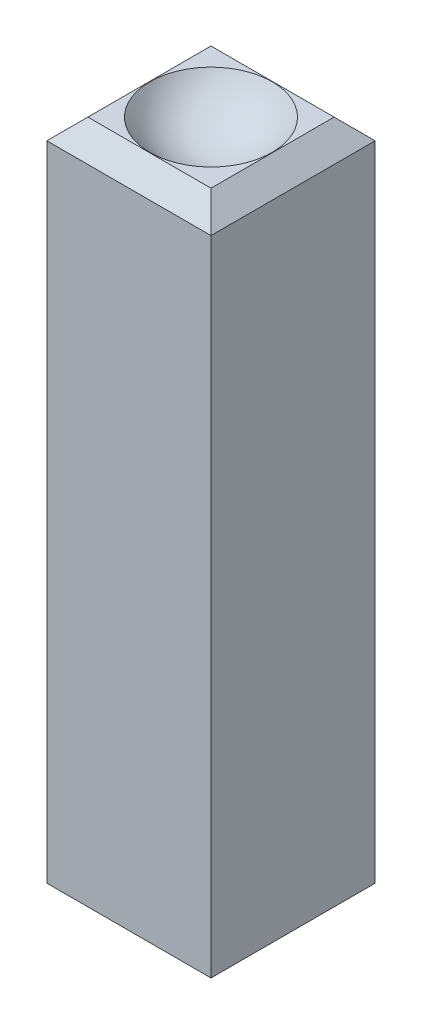
ISO-10303-21;
HEADER;
FILE_DESCRIPTION(('STEP AP214'),'2;1');
FILE_NAME('part.step','',(''),(''),'','','');
FILE_SCHEMA(('AUTOMOTIVE_DESIGN { 1 0 10303 214 1 1 1 1 }'));
ENDSEC;
DATA;
#1=APPLICATION_CONTEXT('core data for automotive mechanical design processes');
#2=APPLICATION_PROTOCOL_DEFINITION('international standard','automotive_design',2000,#1);
#3=PRODUCT_CONTEXT('',#1,'mechanical');
#4=PRODUCT('Part','Part','',(#3));
#5=PRODUCT_RELATED_PRODUCT_CATEGORY('part','',(#4));
#6=PRODUCT_DEFINITION_FORMATION('','',#4);
#7=PRODUCT_DEFINITION_CONTEXT('part definition',#1,'design');
#8=PRODUCT_DEFINITION('design','',#6,#7);
#9=PRODUCT_DEFINITION_SHAPE('','',#8);
#10=(LENGTH_UNIT() NAMED_UNIT(*) SI_UNIT(.MILLI.,.METRE.));
#11=(NAMED_UNIT(*) PLANE_ANGLE_UNIT() SI_UNIT($,.RADIAN.));
#12=(NAMED_UNIT(*) SI_UNIT($,.STERADIAN.) SOLID_ANGLE_UNIT());
#13=UNCERTAINTY_MEASURE_WITH_UNIT(LENGTH_MEASURE(1.E-05),#10,'distance_accuracy_value','');
#14=(GEOMETRIC_REPRESENTATION_CONTEXT(3) GLOBAL_UNCERTAINTY_ASSIGNED_CONTEXT((#13)) GLOBAL_UNIT_ASSIGNED_CONTEXT((#10,
#11,#12)) REPRESENTATION_CONTEXT('',''));
#15=CARTESIAN_POINT('',(0.,0.,0.));
#16=DIRECTION('',(0.,0.,1.));
#17=DIRECTION('',(1.,0.,0.));
#18=AXIS2_PLACEMENT_3D('',#15,#16,#17);
#19=CARTESIAN_POINT('',(0.,48.5,12.));
#20=DIRECTION('',(0.,0.,-1.));
#21=DIRECTION('',(-1.,0.,0.));
#22=AXIS2_PLACEMENT_3D('',#19,#20,#21);
#23=PLANE('',#22);
#24=DIRECTION('',(0.,-1.,0.));
#25=VECTOR('',#24,1.);
#26=CARTESIAN_POINT('',(12.,48.5,12.));
#27=LINE('',#26,#25);
#28=CARTESIAN_POINT('',(12.,45.5,12.));
#29=VERTEX_POINT('',#28);
#30=CARTESIAN_POINT('',(12.,-48.5,12.));
#31=VERTEX_POINT('',#30);
#32=EDGE_CURVE('E187',#29,#31,#27,.T.);
#33=ORIENTED_EDGE('',*,*,#32,.F.);
#34=DIRECTION('',(-1.,0.,0.));
#35=VECTOR('',#34,1.);
#36=CARTESIAN_POINT('',(-12.,45.5,12.));
#37=LINE('',#36,#35);
#38=CARTESIAN_POINT('',(-12.,45.5,12.));
#39=VERTEX_POINT('',#38);
#40=EDGE_CURVE('E11',#29,#39,#37,.T.);
#41=ORIENTED_EDGE('',*,*,#40,.T.);
#42=DIRECTION('',(0.,-1.,0.));
#43=VECTOR('',#42,1.);
#44=CARTESIAN_POINT('',(-12.,48.5,12.));
#45=LINE('',#44,#43);
#46=CARTESIAN_POINT('',(-12.,-48.5,12.));
#47=VERTEX_POINT('',#46);
#48=EDGE_CURVE('E181',#39,#47,#45,.T.);
#49=ORIENTED_EDGE('',*,*,#48,.T.);
#50=DIRECTION('',(1.,0.,0.));
#51=VECTOR('',#50,1.);
#52=CARTESIAN_POINT('',(0.,-48.5,12.));
#53=LINE('',#52,#51);
#54=EDGE_CURVE('E166',#47,#31,#53,.T.);
#55=ORIENTED_EDGE('',*,*,#54,.T.);
#56=EDGE_LOOP('',(#33,#41,#49,#55));
#57=FACE_BOUND('',#56,.T.);
#58=ADVANCED_FACE('F47',(#57),#23,.F.);
#59=CARTESIAN_POINT('',(12.,48.5,0.));
#60=DIRECTION('',(-1.,0.,0.));
#61=DIRECTION('',(0.,0.,1.));
#62=AXIS2_PLACEMENT_3D('',#59,#60,#61);
#63=PLANE('',#62);
#64=DIRECTION('',(0.,-1.,0.));
#65=VECTOR('',#64,1.);
#66=CARTESIAN_POINT('',(12.,48.5,-12.));
#67=LINE('',#66,#65);
#68=CARTESIAN_POINT('',(12.,45.5,-12.));
#69=VERTEX_POINT('',#68);
#70=CARTESIAN_POINT('',(12.,-48.5,-12.));
#71=VERTEX_POINT('',#70);
#72=EDGE_CURVE('E185',#69,#71,#67,.T.);
#73=ORIENTED_EDGE('',*,*,#72,.F.);
#74=DIRECTION('',(0.,0.,1.));
#75=VECTOR('',#74,1.);
#76=CARTESIAN_POINT('',(12.,45.5,12.));
#77=LINE('',#76,#75);
#78=EDGE_CURVE('E71',#69,#29,#77,.T.);
#79=ORIENTED_EDGE('',*,*,#78,.T.);
#80=ORIENTED_EDGE('',*,*,#32,.T.);
#81=DIRECTION('',(0.,0.,-1.));
#82=VECTOR('',#81,1.);
#83=CARTESIAN_POINT('',(12.,-48.5,0.));
#84=LINE('',#83,#82);
#85=EDGE_CURVE('E172',#31,#71,#84,.T.);
#86=ORIENTED_EDGE('',*,*,#85,.T.);
#87=EDGE_LOOP('',(#73,#79,#80,#86));
#88=FACE_BOUND('',#87,.T.);
#89=ADVANCED_FACE('F239',(#88),#63,.F.);
#90=CARTESIAN_POINT('',(0.,48.5,-12.));
#91=DIRECTION('',(0.,0.,-1.));
#92=DIRECTION('',(-1.,0.,0.));
#93=AXIS2_PLACEMENT_3D('',#90,#91,#92);
#94=PLANE('',#93);
#95=DIRECTION('',(0.,-1.,0.));
#96=VECTOR('',#95,1.);
#97=CARTESIAN_POINT('',(-12.,48.5,-12.));
#98=LINE('',#97,#96);
#99=CARTESIAN_POINT('',(-12.,45.5,-12.));
#100=VERTEX_POINT('',#99);
#101=CARTESIAN_POINT('',(-12.,-48.5,-12.));
#102=VERTEX_POINT('',#101);
#103=EDGE_CURVE('E183',#100,#102,#98,.T.);
#104=ORIENTED_EDGE('',*,*,#103,.F.);
#105=DIRECTION('',(1.,0.,0.));
#106=VECTOR('',#105,1.);
#107=CARTESIAN_POINT('',(0.,45.5,-12.));
#108=LINE('',#107,#106);
#109=EDGE_CURVE('E189',#100,#69,#108,.T.);
#110=ORIENTED_EDGE('',*,*,#109,.T.);
#111=ORIENTED_EDGE('',*,*,#72,.T.);
#112=DIRECTION('',(1.,0.,0.));
#113=VECTOR('',#112,1.);
#114=CARTESIAN_POINT('',(0.,-48.5,-12.));
#115=LINE('',#114,#113);
#116=EDGE_CURVE('E175',#102,#71,#115,.T.);
#117=ORIENTED_EDGE('',*,*,#116,.F.);
#118=EDGE_LOOP('',(#104,#110,#111,#117));
#119=FACE_BOUND('',#118,.T.);
#120=ADVANCED_FACE('F234',(#119),#94,.T.);
#121=CARTESIAN_POINT('',(-12.,48.5,0.));
#122=DIRECTION('',(-1.,0.,0.));
#123=DIRECTION('',(0.,0.,1.));
#124=AXIS2_PLACEMENT_3D('',#121,#122,#123);
#125=PLANE('',#124);
#126=ORIENTED_EDGE('',*,*,#48,.F.);
#127=DIRECTION('',(0.,0.,-1.));
#128=VECTOR('',#127,1.);
#129=CARTESIAN_POINT('',(-12.,45.5,0.));
#130=LINE('',#129,#128);
#131=EDGE_CURVE('E57',#39,#100,#130,.T.);
#132=ORIENTED_EDGE('',*,*,#131,.T.);
#133=ORIENTED_EDGE('',*,*,#103,.T.);
#134=DIRECTION('',(0.,0.,-1.));
#135=VECTOR('',#134,1.);
#136=CARTESIAN_POINT('',(-12.,-48.5,0.));
#137=LINE('',#136,#135);
#138=EDGE_CURVE('E178',#47,#102,#137,.T.);
#139=ORIENTED_EDGE('',*,*,#138,.F.);
#140=EDGE_LOOP('',(#126,#132,#133,#139));
#141=FACE_BOUND('',#140,.T.);
#142=ADVANCED_FACE('F224',(#141),#125,.T.);
#143=CARTESIAN_POINT('',(0.,48.5,0.));
#144=DIRECTION('',(0.,1.,0.));
#145=DIRECTION('',(0.,0.,1.));
#146=AXIS2_PLACEMENT_3D('',#143,#144,#145);
#147=PLANE('',#146);
#148=DIRECTION('',(0.,0.,-1.));
#149=VECTOR('',#148,1.);
#150=CARTESIAN_POINT('',(8.99999999999999,48.5,-12.));
#151=LINE('',#150,#149);
#152=CARTESIAN_POINT('',(8.99999999999999,48.5,9.));
#153=VERTEX_POINT('',#152);
#154=CARTESIAN_POINT('',(8.99999999999999,48.5,-9.));
#155=VERTEX_POINT('',#154);
#156=EDGE_CURVE('E196',#153,#155,#151,.T.);
#157=ORIENTED_EDGE('',*,*,#156,.T.);
#158=DIRECTION('',(-1.,0.,0.));
#159=VECTOR('',#158,1.);
#160=CARTESIAN_POINT('',(0.,48.5,-9.));
#161=LINE('',#160,#159);
#162=CARTESIAN_POINT('',(-9.,48.5,-9.));
#163=VERTEX_POINT('',#162);
#164=EDGE_CURVE('E198',#155,#163,#161,.T.);
#165=ORIENTED_EDGE('',*,*,#164,.T.);
#166=DIRECTION('',(0.,0.,1.));
#167=VECTOR('',#166,1.);
#168=CARTESIAN_POINT('',(-9.,48.5,0.));
#169=LINE('',#168,#167);
#170=CARTESIAN_POINT('',(-9.,48.5,9.));
#171=VERTEX_POINT('',#170);
#172=EDGE_CURVE('E194',#163,#171,#169,.T.);
#173=ORIENTED_EDGE('',*,*,#172,.T.);
#174=DIRECTION('',(1.,0.,0.));
#175=VECTOR('',#174,1.);
#176=CARTESIAN_POINT('',(12.,48.5,9.));
#177=LINE('',#176,#175);
#178=EDGE_CURVE('E192',#171,#153,#177,.T.);
#179=ORIENTED_EDGE('',*,*,#178,.T.);
#180=EDGE_LOOP('',(#157,#165,#173,#179));
#181=FACE_BOUND('',#180,.T.);
#182=CARTESIAN_POINT('',(0.,48.5,0.));
#183=DIRECTION('',(0.,1.,0.));
#184=DIRECTION('',(0.,0.,1.));
#185=AXIS2_PLACEMENT_3D('',#182,#183,#184);
#186=CIRCLE('',#185,8.94776508408665);
#187=CARTESIAN_POINT('',(0.,48.5,8.94776508408665));
#188=VERTEX_POINT('',#187);
#189=EDGE_CURVE('E155',#188,#188,#186,.T.);
#190=ORIENTED_EDGE('',*,*,#189,.F.);
#191=EDGE_LOOP('',(#190));
#192=FACE_BOUND('',#191,.T.);
#193=ADVANCED_FACE('F221',(#181,#192),#147,.T.);
#194=CARTESIAN_POINT('',(0.,-48.5,0.));
#195=DIRECTION('',(0.,1.,0.));
#196=DIRECTION('',(0.,0.,1.));
#197=AXIS2_PLACEMENT_3D('',#194,#195,#196);
#198=PLANE('',#197);
#199=DIRECTION('',(1.,0.,0.));
#200=VECTOR('',#199,1.);
#201=CARTESIAN_POINT('',(0.,-48.5,-10.25));
#202=LINE('',#201,#200);
#203=CARTESIAN_POINT('',(-10.25,-48.5,-10.25));
#204=VERTEX_POINT('',#203);
#205=CARTESIAN_POINT('',(10.25,-48.5,-10.25));
#206=VERTEX_POINT('',#205);
#207=EDGE_CURVE('E160',#204,#206,#202,.T.);
#208=ORIENTED_EDGE('',*,*,#207,.F.);
#209=DIRECTION('',(0.,0.,-1.));
#210=VECTOR('',#209,1.);
#211=CARTESIAN_POINT('',(-10.25,-48.5,0.));
#212=LINE('',#211,#210);
#213=CARTESIAN_POINT('',(-10.25,-48.5,10.25));
#214=VERTEX_POINT('',#213);
#215=EDGE_CURVE('E132',#214,#204,#212,.T.);
#216=ORIENTED_EDGE('',*,*,#215,.F.);
#217=DIRECTION('',(1.,0.,0.));
#218=VECTOR('',#217,1.);
#219=CARTESIAN_POINT('',(0.,-48.5,10.25));
#220=LINE('',#219,#218);
#221=CARTESIAN_POINT('',(10.25,-48.5,10.25));
#222=VERTEX_POINT('',#221);
#223=EDGE_CURVE('E149',#214,#222,#220,.T.);
#224=ORIENTED_EDGE('',*,*,#223,.T.);
#225=DIRECTION('',(0.,0.,-1.));
#226=VECTOR('',#225,1.);
#227=CARTESIAN_POINT('',(10.25,-48.5,0.));
#228=LINE('',#227,#226);
#229=EDGE_CURVE('E152',#222,#206,#228,.T.);
#230=ORIENTED_EDGE('',*,*,#229,.T.);
#231=EDGE_LOOP('',(#208,#216,#224,#230));
#232=FACE_BOUND('',#231,.T.);
#233=ORIENTED_EDGE('',*,*,#54,.F.);
#234=ORIENTED_EDGE('',*,*,#138,.T.);
#235=ORIENTED_EDGE('',*,*,#116,.T.);
#236=ORIENTED_EDGE('',*,*,#85,.F.);
#237=EDGE_LOOP('',(#233,#234,#235,#236));
#238=FACE_BOUND('',#237,.T.);
#239=ADVANCED_FACE('F223',(#232,#238),#198,.F.);
#240=CARTESIAN_POINT('',(-10.25,-8.5,0.));
#241=DIRECTION('',(-1.,0.,0.));
#242=DIRECTION('',(0.,0.,1.));
#243=AXIS2_PLACEMENT_3D('',#240,#241,#242);
#244=PLANE('',#243);
#245=ORIENTED_EDGE('',*,*,#215,.T.);
#246=DIRECTION('',(0.,-1.,0.));
#247=VECTOR('',#246,1.);
#248=CARTESIAN_POINT('',(-10.25,-8.5,-10.25));
#249=LINE('',#248,#247);
#250=CARTESIAN_POINT('',(-10.25,-8.5,-10.25));
#251=VERTEX_POINT('',#250);
#252=EDGE_CURVE('E126',#251,#204,#249,.T.);
#253=ORIENTED_EDGE('',*,*,#252,.F.);
#254=DIRECTION('',(0.,0.,-1.));
#255=VECTOR('',#254,1.);
#256=CARTESIAN_POINT('',(-10.25,-8.5,0.));
#257=LINE('',#256,#255);
#258=CARTESIAN_POINT('',(-10.25,-8.5,10.25));
#259=VERTEX_POINT('',#258);
#260=EDGE_CURVE('E130',#259,#251,#257,.T.);
#261=ORIENTED_EDGE('',*,*,#260,.F.);
#262=DIRECTION('',(0.,-1.,0.));
#263=VECTOR('',#262,1.);
#264=CARTESIAN_POINT('',(-10.25,-8.5,10.25));
#265=LINE('',#264,#263);
#266=EDGE_CURVE('E164',#259,#214,#265,.T.);
#267=ORIENTED_EDGE('',*,*,#266,.T.);
#268=EDGE_LOOP('',(#245,#253,#261,#267));
#269=FACE_BOUND('',#268,.T.);
#270=ADVANCED_FACE('F128',(#269),#244,.F.);
#271=CARTESIAN_POINT('',(0.,-8.5,10.25));
#272=DIRECTION('',(0.,0.,-1.));
#273=DIRECTION('',(-1.,0.,0.));
#274=AXIS2_PLACEMENT_3D('',#271,#272,#273);
#275=PLANE('',#274);
#276=ORIENTED_EDGE('',*,*,#223,.F.);
#277=ORIENTED_EDGE('',*,*,#266,.F.);
#278=DIRECTION('',(1.,0.,0.));
#279=VECTOR('',#278,1.);
#280=CARTESIAN_POINT('',(0.,-8.5,10.25));
#281=LINE('',#280,#279);
#282=CARTESIAN_POINT('',(10.25,-8.5,10.25));
#283=VERTEX_POINT('',#282);
#284=EDGE_CURVE('E137',#259,#283,#281,.T.);
#285=ORIENTED_EDGE('',*,*,#284,.T.);
#286=DIRECTION('',(0.,-1.,0.));
#287=VECTOR('',#286,1.);
#288=CARTESIAN_POINT('',(10.25,-8.5,10.25));
#289=LINE('',#288,#287);
#290=EDGE_CURVE('E167',#283,#222,#289,.T.);
#291=ORIENTED_EDGE('',*,*,#290,.T.);
#292=EDGE_LOOP('',(#276,#277,#285,#291));
#293=FACE_BOUND('',#292,.T.);
#294=ADVANCED_FACE('F313',(#293),#275,.T.);
#295=CARTESIAN_POINT('',(10.25,-8.5,0.));
#296=DIRECTION('',(-1.,0.,0.));
#297=DIRECTION('',(0.,0.,1.));
#298=AXIS2_PLACEMENT_3D('',#295,#296,#297);
#299=PLANE('',#298);
#300=ORIENTED_EDGE('',*,*,#229,.F.);
#301=ORIENTED_EDGE('',*,*,#290,.F.);
#302=DIRECTION('',(0.,0.,-1.));
#303=VECTOR('',#302,1.);
#304=CARTESIAN_POINT('',(10.25,-8.5,0.));
#305=LINE('',#304,#303);
#306=CARTESIAN_POINT('',(10.25,-8.5,-10.25));
#307=VERTEX_POINT('',#306);
#308=EDGE_CURVE('E145',#283,#307,#305,.T.);
#309=ORIENTED_EDGE('',*,*,#308,.T.);
#310=DIRECTION('',(0.,-1.,0.));
#311=VECTOR('',#310,1.);
#312=CARTESIAN_POINT('',(10.25,-8.5,-10.25));
#313=LINE('',#312,#311);
#314=EDGE_CURVE('E136',#307,#206,#313,.T.);
#315=ORIENTED_EDGE('',*,*,#314,.T.);
#316=EDGE_LOOP('',(#300,#301,#309,#315));
#317=FACE_BOUND('',#316,.T.);
#318=ADVANCED_FACE('F321',(#317),#299,.T.);
#319=CARTESIAN_POINT('',(0.,-8.5,-10.25));
#320=DIRECTION('',(0.,0.,-1.));
#321=DIRECTION('',(-1.,0.,0.));
#322=AXIS2_PLACEMENT_3D('',#319,#320,#321);
#323=PLANE('',#322);
#324=ORIENTED_EDGE('',*,*,#207,.T.);
#325=ORIENTED_EDGE('',*,*,#314,.F.);
#326=DIRECTION('',(1.,0.,0.));
#327=VECTOR('',#326,1.);
#328=CARTESIAN_POINT('',(0.,-8.5,-10.25));
#329=LINE('',#328,#327);
#330=EDGE_CURVE('E141',#251,#307,#329,.T.);
#331=ORIENTED_EDGE('',*,*,#330,.F.);
#332=ORIENTED_EDGE('',*,*,#252,.T.);
#333=EDGE_LOOP('',(#324,#325,#331,#332));
#334=FACE_BOUND('',#333,.T.);
#335=ADVANCED_FACE('F142',(#334),#323,.F.);
#336=CARTESIAN_POINT('',(0.,-8.5,0.));
#337=DIRECTION('',(0.,-1.,0.));
#338=DIRECTION('',(0.,0.,-1.));
#339=AXIS2_PLACEMENT_3D('',#336,#337,#338);
#340=PLANE('',#339);
#341=ORIENTED_EDGE('',*,*,#260,.T.);
#342=ORIENTED_EDGE('',*,*,#330,.T.);
#343=ORIENTED_EDGE('',*,*,#308,.F.);
#344=ORIENTED_EDGE('',*,*,#284,.F.);
#345=EDGE_LOOP('',(#341,#342,#343,#344));
#346=FACE_BOUND('',#345,.T.);
#347=ADVANCED_FACE('F148',(#346),#340,.T.);
#348=CARTESIAN_POINT('',(0.,53.5,0.));
#349=DIRECTION('',(0.,1.,0.));
#350=DIRECTION('',(-1.,0.,0.));
#351=AXIS2_PLACEMENT_3D('',#348,#349,#350);
#352=SPHERICAL_SURFACE('',#351,10.25);
#353=ORIENTED_EDGE('',*,*,#189,.T.);
#354=EDGE_LOOP('',(#353));
#355=FACE_BOUND('',#354,.T.);
#356=ADVANCED_FACE('F219',(#355),#352,.F.);
#357=CARTESIAN_POINT('',(0.,48.5,9.));
#358=DIRECTION('',(0.,0.707106781186546,0.707106781186549));
#359=DIRECTION('',(-1.,0.,0.));
#360=AXIS2_PLACEMENT_3D('',#357,#358,#359);
#361=PLANE('',#360);
#362=DIRECTION('',(-0.577350269189625,0.577350269189628,-0.577350269189625));
#363=VECTOR('',#362,1.);
#364=CARTESIAN_POINT('',(6.00000000000001,51.5,6.00000000000001));
#365=LINE('',#364,#363);
#366=EDGE_CURVE('E206',#153,#29,#365,.F.);
#367=ORIENTED_EDGE('',*,*,#366,.F.);
#368=ORIENTED_EDGE('',*,*,#178,.F.);
#369=DIRECTION('',(0.577350269189625,0.577350269189628,-0.577350269189625));
#370=VECTOR('',#369,1.);
#371=CARTESIAN_POINT('',(-6.00000000000001,51.5,6.00000000000001));
#372=LINE('',#371,#370);
#373=EDGE_CURVE('E52',#39,#171,#372,.T.);
#374=ORIENTED_EDGE('',*,*,#373,.F.);
#375=ORIENTED_EDGE('',*,*,#40,.F.);
#376=EDGE_LOOP('',(#367,#368,#374,#375));
#377=FACE_BOUND('',#376,.T.);
#378=ADVANCED_FACE('F50',(#377),#361,.T.);
#379=CARTESIAN_POINT('',(-12.,45.5,0.));
#380=DIRECTION('',(0.707106781186549,-0.707106781186546,0.));
#381=DIRECTION('',(0.,0.,-1.));
#382=AXIS2_PLACEMENT_3D('',#379,#380,#381);
#383=PLANE('',#382);
#384=ORIENTED_EDGE('',*,*,#373,.T.);
#385=ORIENTED_EDGE('',*,*,#172,.F.);
#386=DIRECTION('',(-0.577350269189625,-0.577350269189628,-0.577350269189625));
#387=VECTOR('',#386,1.);
#388=CARTESIAN_POINT('',(-8.00000000000002,49.5,-8.00000000000001));
#389=LINE('',#388,#387);
#390=EDGE_CURVE('E205',#100,#163,#389,.F.);
#391=ORIENTED_EDGE('',*,*,#390,.F.);
#392=ORIENTED_EDGE('',*,*,#131,.F.);
#393=EDGE_LOOP('',(#384,#385,#391,#392));
#394=FACE_BOUND('',#393,.T.);
#395=ADVANCED_FACE('F261',(#394),#383,.F.);
#396=CARTESIAN_POINT('',(8.99999999999999,48.5,0.));
#397=DIRECTION('',(0.707106781186549,0.707106781186546,0.));
#398=DIRECTION('',(0.,0.,1.));
#399=AXIS2_PLACEMENT_3D('',#396,#397,#398);
#400=PLANE('',#399);
#401=ORIENTED_EDGE('',*,*,#366,.T.);
#402=ORIENTED_EDGE('',*,*,#78,.F.);
#403=DIRECTION('',(0.577350269189625,-0.577350269189628,-0.577350269189625));
#404=VECTOR('',#403,1.);
#405=CARTESIAN_POINT('',(6.,51.5,-6.00000000000001));
#406=LINE('',#405,#404);
#407=EDGE_CURVE('E203',#155,#69,#406,.T.);
#408=ORIENTED_EDGE('',*,*,#407,.F.);
#409=ORIENTED_EDGE('',*,*,#156,.F.);
#410=EDGE_LOOP('',(#401,#402,#408,#409));
#411=FACE_BOUND('',#410,.T.);
#412=ADVANCED_FACE('F255',(#411),#400,.T.);
#413=CARTESIAN_POINT('',(0.,45.5,-12.));
#414=DIRECTION('',(0.,-0.707106781186546,0.707106781186549));
#415=DIRECTION('',(1.,0.,0.));
#416=AXIS2_PLACEMENT_3D('',#413,#414,#415);
#417=PLANE('',#416);
#418=ORIENTED_EDGE('',*,*,#390,.T.);
#419=ORIENTED_EDGE('',*,*,#164,.F.);
#420=ORIENTED_EDGE('',*,*,#407,.T.);
#421=ORIENTED_EDGE('',*,*,#109,.F.);
#422=EDGE_LOOP('',(#418,#419,#420,#421));
#423=FACE_BOUND('',#422,.T.);
#424=ADVANCED_FACE('F249',(#423),#417,.F.);
#425=CLOSED_SHELL('',(#58,#89,#120,#142,#193,#239,#270,#294,#318,#335,#347,#356,#378,#395,#412,#424));
#426=MANIFOLD_SOLID_BREP('B2',#425);
#427=ADVANCED_BREP_SHAPE_REPRESENTATION('',(#18,#426),#14);
#428=SHAPE_DEFINITION_REPRESENTATION(#9,#427);
ENDSEC;
END-ISO-10303-21;
